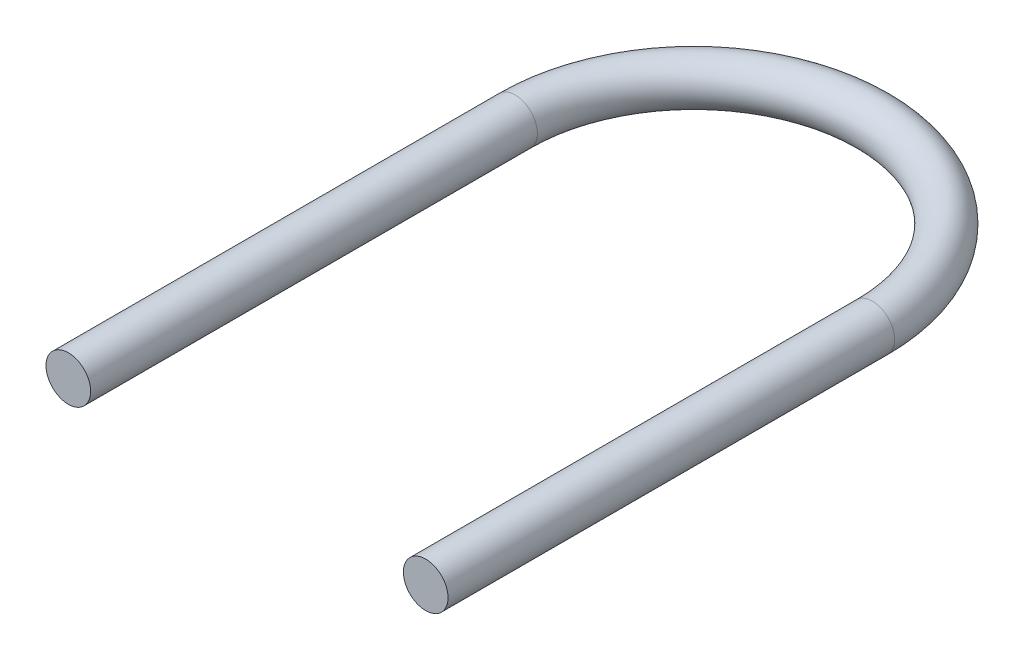
ISO-10303-21;
HEADER;
FILE_DESCRIPTION(('STEP AP214'),'2;1');
FILE_NAME('part.step','',(''),(''),'','','');
FILE_SCHEMA(('AUTOMOTIVE_DESIGN { 1 0 10303 214 1 1 1 1 }'));
ENDSEC;
DATA;
#1=APPLICATION_CONTEXT('core data for automotive mechanical design processes');
#2=APPLICATION_PROTOCOL_DEFINITION('international standard','automotive_design',2000,#1);
#3=PRODUCT_CONTEXT('',#1,'mechanical');
#4=PRODUCT('Part','Part','',(#3));
#5=PRODUCT_RELATED_PRODUCT_CATEGORY('part','',(#4));
#6=PRODUCT_DEFINITION_FORMATION('','',#4);
#7=PRODUCT_DEFINITION_CONTEXT('part definition',#1,'design');
#8=PRODUCT_DEFINITION('design','',#6,#7);
#9=PRODUCT_DEFINITION_SHAPE('','',#8);
#10=(LENGTH_UNIT() NAMED_UNIT(*) SI_UNIT(.MILLI.,.METRE.));
#11=(NAMED_UNIT(*) PLANE_ANGLE_UNIT() SI_UNIT($,.RADIAN.));
#12=(NAMED_UNIT(*) SI_UNIT($,.STERADIAN.) SOLID_ANGLE_UNIT());
#13=UNCERTAINTY_MEASURE_WITH_UNIT(LENGTH_MEASURE(1.E-05),#10,'distance_accuracy_value','');
#14=(GEOMETRIC_REPRESENTATION_CONTEXT(3) GLOBAL_UNCERTAINTY_ASSIGNED_CONTEXT((#13)) GLOBAL_UNIT_ASSIGNED_CONTEXT((#10,
#11,#12)) REPRESENTATION_CONTEXT('',''));
#15=CARTESIAN_POINT('',(0.,0.,0.));
#16=DIRECTION('',(0.,0.,1.));
#17=DIRECTION('',(1.,0.,0.));
#18=AXIS2_PLACEMENT_3D('',#15,#16,#17);
#19=CARTESIAN_POINT('',(0.,0.,0.));
#20=DIRECTION('',(0.,0.,1.));
#21=DIRECTION('',(1.,0.,0.));
#22=AXIS2_PLACEMENT_3D('',#19,#20,#21);
#23=PLANE('',#22);
#24=CARTESIAN_POINT('',(0.,0.,0.));
#25=DIRECTION('',(0.,0.,1.));
#26=DIRECTION('',(1.,0.,0.));
#27=AXIS2_PLACEMENT_3D('',#24,#25,#26);
#28=CIRCLE('',#27,12.7);
#29=CARTESIAN_POINT('',(12.7,0.,0.));
#30=VERTEX_POINT('',#29);
#31=EDGE_CURVE('E45',#30,#30,#28,.T.);
#32=ORIENTED_EDGE('',*,*,#31,.T.);
#33=EDGE_LOOP('',(#32));
#34=FACE_BOUND('',#33,.T.);
#35=ADVANCED_FACE('F33',(#34),#23,.T.);
#36=CARTESIAN_POINT('',(203.2,0.,0.));
#37=DIRECTION('',(0.,0.,-1.));
#38=DIRECTION('',(-1.,0.,0.));
#39=AXIS2_PLACEMENT_3D('',#36,#37,#38);
#40=PLANE('',#39);
#41=CARTESIAN_POINT('',(203.2,0.,0.));
#42=DIRECTION('',(0.,0.,-1.));
#43=DIRECTION('',(-1.,0.,0.));
#44=AXIS2_PLACEMENT_3D('',#41,#42,#43);
#45=CIRCLE('',#44,12.7);
#46=CARTESIAN_POINT('',(190.5,0.,0.));
#47=VERTEX_POINT('',#46);
#48=EDGE_CURVE('E11',#47,#47,#45,.T.);
#49=ORIENTED_EDGE('',*,*,#48,.F.);
#50=EDGE_LOOP('',(#49));
#51=FACE_BOUND('',#50,.T.);
#52=ADVANCED_FACE('F51',(#51),#40,.F.);
#53=CARTESIAN_POINT('',(0.,0.,0.));
#54=DIRECTION('',(0.,0.,-1.));
#55=DIRECTION('',(-1.,0.,0.));
#56=AXIS2_PLACEMENT_3D('',#53,#54,#55);
#57=CYLINDRICAL_SURFACE('',#56,12.7);
#58=CARTESIAN_POINT('',(0.,0.,-254.));
#59=DIRECTION('',(0.,0.,1.));
#60=DIRECTION('',(1.,0.,0.));
#61=AXIS2_PLACEMENT_3D('',#58,#59,#60);
#62=CIRCLE('',#61,12.7);
#63=CARTESIAN_POINT('',(-12.7,0.,-254.));
#64=VERTEX_POINT('',#63);
#65=EDGE_CURVE('E76',#64,#64,#62,.T.);
#66=ORIENTED_EDGE('',*,*,#65,.T.);
#67=EDGE_LOOP('',(#66));
#68=FACE_BOUND('',#67,.T.);
#69=ORIENTED_EDGE('',*,*,#31,.F.);
#70=EDGE_LOOP('',(#69));
#71=FACE_BOUND('',#70,.T.);
#72=ADVANCED_FACE('F53',(#68,#71),#57,.T.);
#73=CARTESIAN_POINT('',(101.6,0.,-254.));
#74=DIRECTION('',(0.,-1.,0.));
#75=DIRECTION('',(0.,0.,-1.));
#76=AXIS2_PLACEMENT_3D('',#73,#74,#75);
#77=TOROIDAL_SURFACE('',#76,101.6,12.7);
#78=CARTESIAN_POINT('',(203.2,0.,-254.));
#79=DIRECTION('',(0.,0.,-1.));
#80=DIRECTION('',(-1.,0.,0.));
#81=AXIS2_PLACEMENT_3D('',#78,#79,#80);
#82=CIRCLE('',#81,12.7);
#83=CARTESIAN_POINT('',(215.9,0.,-254.));
#84=VERTEX_POINT('',#83);
#85=EDGE_CURVE('E40',#84,#84,#82,.T.);
#86=CARTESIAN_POINT('',(101.6,0.,-254.));
#87=DIRECTION('',(0.,-1.,0.));
#88=DIRECTION('',(0.,0.,-1.));
#89=AXIS2_PLACEMENT_3D('',#86,#87,#88);
#90=CIRCLE('',#89,114.3);
#91=EDGE_CURVE('',#64,#84,#90,.T.);
#92=ORIENTED_EDGE('',*,*,#65,.F.);
#93=ORIENTED_EDGE('',*,*,#85,.T.);
#94=ORIENTED_EDGE('',*,*,#91,.T.);
#95=ORIENTED_EDGE('',*,*,#91,.F.);
#96=EDGE_LOOP('',(#92,#94,#93,#95));
#97=FACE_BOUND('',#96,.T.);
#98=ADVANCED_FACE('F58',(#97),#77,.T.);
#99=CARTESIAN_POINT('',(203.2,0.,-254.));
#100=DIRECTION('',(0.,0.,1.));
#101=DIRECTION('',(1.,0.,0.));
#102=AXIS2_PLACEMENT_3D('',#99,#100,#101);
#103=CYLINDRICAL_SURFACE('',#102,12.7);
#104=ORIENTED_EDGE('',*,*,#48,.T.);
#105=EDGE_LOOP('',(#104));
#106=FACE_BOUND('',#105,.T.);
#107=ORIENTED_EDGE('',*,*,#85,.F.);
#108=EDGE_LOOP('',(#107));
#109=FACE_BOUND('',#108,.T.);
#110=ADVANCED_FACE('F48',(#106,#109),#103,.T.);
#111=CLOSED_SHELL('',(#35,#52,#72,#98,#110));
#112=MANIFOLD_SOLID_BREP('B2',#111);
#113=ADVANCED_BREP_SHAPE_REPRESENTATION('',(#18,#112),#14);
#114=SHAPE_DEFINITION_REPRESENTATION(#9,#113);
ENDSEC;
END-ISO-10303-21;
